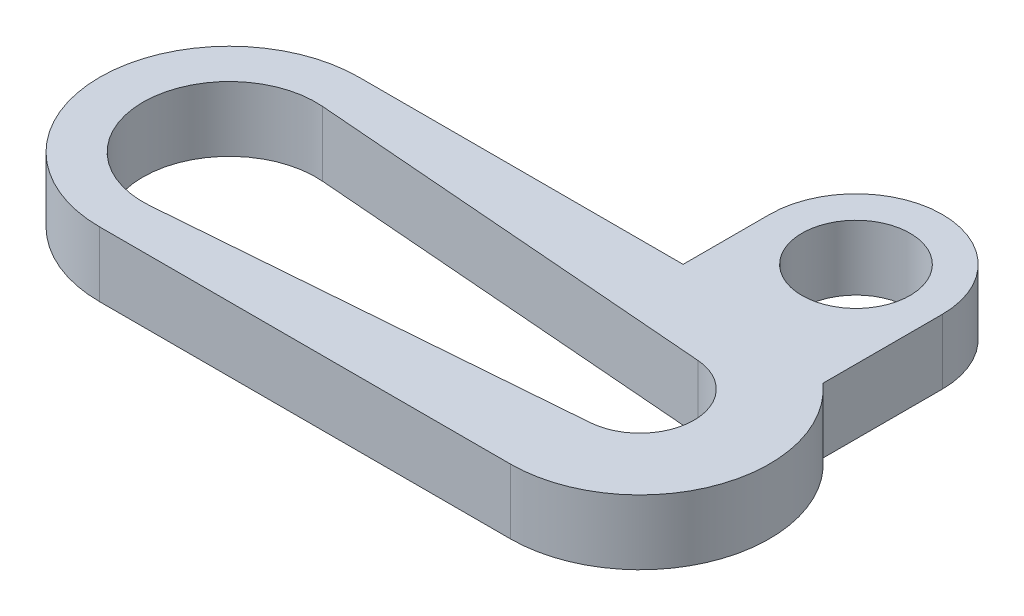
ISO-10303-21;
HEADER;
FILE_DESCRIPTION(('STEP AP214'),'2;1');
FILE_NAME('part.step','',(''),(''),'','','');
FILE_SCHEMA(('AUTOMOTIVE_DESIGN { 1 0 10303 214 1 1 1 1 }'));
ENDSEC;
DATA;
#1=APPLICATION_CONTEXT('core data for automotive mechanical design processes');
#2=APPLICATION_PROTOCOL_DEFINITION('international standard','automotive_design',2000,#1);
#3=PRODUCT_CONTEXT('',#1,'mechanical');
#4=PRODUCT('Part','Part','',(#3));
#5=PRODUCT_RELATED_PRODUCT_CATEGORY('part','',(#4));
#6=PRODUCT_DEFINITION_FORMATION('','',#4);
#7=PRODUCT_DEFINITION_CONTEXT('part definition',#1,'design');
#8=PRODUCT_DEFINITION('design','',#6,#7);
#9=PRODUCT_DEFINITION_SHAPE('','',#8);
#10=(LENGTH_UNIT() NAMED_UNIT(*) SI_UNIT(.MILLI.,.METRE.));
#11=(NAMED_UNIT(*) PLANE_ANGLE_UNIT() SI_UNIT($,.RADIAN.));
#12=(NAMED_UNIT(*) SI_UNIT($,.STERADIAN.) SOLID_ANGLE_UNIT());
#13=UNCERTAINTY_MEASURE_WITH_UNIT(LENGTH_MEASURE(1.E-05),#10,'distance_accuracy_value','');
#14=(GEOMETRIC_REPRESENTATION_CONTEXT(3) GLOBAL_UNCERTAINTY_ASSIGNED_CONTEXT((#13)) GLOBAL_UNIT_ASSIGNED_CONTEXT((#10,
#11,#12)) REPRESENTATION_CONTEXT('',''));
#15=CARTESIAN_POINT('',(0.,0.,0.));
#16=DIRECTION('',(0.,0.,1.));
#17=DIRECTION('',(1.,0.,0.));
#18=AXIS2_PLACEMENT_3D('',#15,#16,#17);
#19=CARTESIAN_POINT('',(19.,3.,0.));
#20=DIRECTION('',(0.,-1.,0.));
#21=DIRECTION('',(0.,0.,-1.));
#22=AXIS2_PLACEMENT_3D('',#19,#20,#21);
#23=CYLINDRICAL_SURFACE('',#22,2.5);
#24=CARTESIAN_POINT('',(19.,0.,0.));
#25=DIRECTION('',(0.,1.,0.));
#26=DIRECTION('',(0.,0.,1.));
#27=AXIS2_PLACEMENT_3D('',#24,#25,#26);
#28=CIRCLE('',#27,2.5);
#29=CARTESIAN_POINT('',(19.1973684210526,0.,2.49219696379945));
#30=VERTEX_POINT('',#29);
#31=CARTESIAN_POINT('',(19.1973684210526,0.,-2.49219696379945));
#32=VERTEX_POINT('',#31);
#33=EDGE_CURVE('E174',#30,#32,#28,.T.);
#34=ORIENTED_EDGE('',*,*,#33,.F.);
#35=DIRECTION('',(0.,-1.,0.));
#36=VECTOR('',#35,1.);
#37=CARTESIAN_POINT('',(19.1973684210526,3.,2.49219696379945));
#38=LINE('',#37,#36);
#39=CARTESIAN_POINT('',(19.1973684210526,3.,2.49219696379945));
#40=VERTEX_POINT('',#39);
#41=EDGE_CURVE('E11',#40,#30,#38,.T.);
#42=ORIENTED_EDGE('',*,*,#41,.F.);
#43=CARTESIAN_POINT('',(19.,3.,0.));
#44=DIRECTION('',(0.,1.,0.));
#45=DIRECTION('',(0.,0.,1.));
#46=AXIS2_PLACEMENT_3D('',#43,#44,#45);
#47=CIRCLE('',#46,2.5);
#48=CARTESIAN_POINT('',(19.1973684210526,3.,-2.49219696379945));
#49=VERTEX_POINT('',#48);
#50=EDGE_CURVE('E138',#40,#49,#47,.T.);
#51=ORIENTED_EDGE('',*,*,#50,.T.);
#52=DIRECTION('',(0.,-1.,0.));
#53=VECTOR('',#52,1.);
#54=CARTESIAN_POINT('',(19.1973684210526,3.,-2.49219696379945));
#55=LINE('',#54,#53);
#56=EDGE_CURVE('E102',#49,#32,#55,.T.);
#57=ORIENTED_EDGE('',*,*,#56,.T.);
#58=EDGE_LOOP('',(#34,#42,#51,#57));
#59=FACE_BOUND('',#58,.T.);
#60=ADVANCED_FACE('F40',(#59),#23,.F.);
#61=CARTESIAN_POINT('',(0.31578947368421,3.,3.98751514207912));
#62=DIRECTION('',(0.0789473684210526,0.,0.996878785519779));
#63=DIRECTION('',(0.99687878551978,0.,-0.0789473684210526));
#64=AXIS2_PLACEMENT_3D('',#61,#62,#63);
#65=PLANE('',#64);
#66=DIRECTION('',(-0.99687878551978,0.,0.0789473684210526));
#67=VECTOR('',#66,1.);
#68=CARTESIAN_POINT('',(0.31578947368421,0.,3.98751514207912));
#69=LINE('',#68,#67);
#70=CARTESIAN_POINT('',(0.31578947368421,0.,3.98751514207912));
#71=VERTEX_POINT('',#70);
#72=EDGE_CURVE('E144',#30,#71,#69,.T.);
#73=ORIENTED_EDGE('',*,*,#72,.T.);
#74=DIRECTION('',(0.,-1.,0.));
#75=VECTOR('',#74,1.);
#76=CARTESIAN_POINT('',(0.31578947368421,3.,3.98751514207912));
#77=LINE('',#76,#75);
#78=CARTESIAN_POINT('',(0.31578947368421,3.,3.98751514207912));
#79=VERTEX_POINT('',#78);
#80=EDGE_CURVE('E50',#79,#71,#77,.T.);
#81=ORIENTED_EDGE('',*,*,#80,.F.);
#82=DIRECTION('',(-0.99687878551978,0.,0.0789473684210526));
#83=VECTOR('',#82,1.);
#84=CARTESIAN_POINT('',(0.31578947368421,3.,3.98751514207912));
#85=LINE('',#84,#83);
#86=EDGE_CURVE('E132',#40,#79,#85,.T.);
#87=ORIENTED_EDGE('',*,*,#86,.F.);
#88=ORIENTED_EDGE('',*,*,#41,.T.);
#89=EDGE_LOOP('',(#73,#81,#87,#88));
#90=FACE_BOUND('',#89,.T.);
#91=ADVANCED_FACE('F142',(#90),#65,.F.);
#92=CARTESIAN_POINT('',(0.,3.,0.));
#93=DIRECTION('',(0.,-1.,0.));
#94=DIRECTION('',(0.,0.,-1.));
#95=AXIS2_PLACEMENT_3D('',#92,#93,#94);
#96=CYLINDRICAL_SURFACE('',#95,4.);
#97=CARTESIAN_POINT('',(0.,0.,0.));
#98=DIRECTION('',(0.,1.,0.));
#99=DIRECTION('',(0.,0.,1.));
#100=AXIS2_PLACEMENT_3D('',#97,#98,#99);
#101=CIRCLE('',#100,4.);
#102=CARTESIAN_POINT('',(0.31578947368421,0.,-3.98751514207912));
#103=VERTEX_POINT('',#102);
#104=EDGE_CURVE('E178',#103,#71,#101,.T.);
#105=ORIENTED_EDGE('',*,*,#104,.F.);
#106=DIRECTION('',(0.,-1.,0.));
#107=VECTOR('',#106,1.);
#108=CARTESIAN_POINT('',(0.31578947368421,3.,-3.98751514207912));
#109=LINE('',#108,#107);
#110=CARTESIAN_POINT('',(0.31578947368421,3.,-3.98751514207912));
#111=VERTEX_POINT('',#110);
#112=EDGE_CURVE('E95',#111,#103,#109,.T.);
#113=ORIENTED_EDGE('',*,*,#112,.F.);
#114=CARTESIAN_POINT('',(0.,3.,0.));
#115=DIRECTION('',(0.,1.,0.));
#116=DIRECTION('',(0.,0.,1.));
#117=AXIS2_PLACEMENT_3D('',#114,#115,#116);
#118=CIRCLE('',#117,4.);
#119=EDGE_CURVE('E137',#111,#79,#118,.T.);
#120=ORIENTED_EDGE('',*,*,#119,.T.);
#121=ORIENTED_EDGE('',*,*,#80,.T.);
#122=EDGE_LOOP('',(#105,#113,#120,#121));
#123=FACE_BOUND('',#122,.T.);
#124=ADVANCED_FACE('F149',(#123),#96,.F.);
#125=CARTESIAN_POINT('',(23.,3.,0.));
#126=DIRECTION('',(1.,0.,0.));
#127=DIRECTION('',(0.,0.,-1.));
#128=AXIS2_PLACEMENT_3D('',#125,#126,#127);
#129=PLANE('',#128);
#130=DIRECTION('',(0.,0.,1.));
#131=VECTOR('',#130,1.);
#132=CARTESIAN_POINT('',(23.,0.,0.));
#133=LINE('',#132,#131);
#134=CARTESIAN_POINT('',(23.,0.,-10.));
#135=VERTEX_POINT('',#134);
#136=CARTESIAN_POINT('',(23.,0.,-4.47213595499958));
#137=VERTEX_POINT('',#136);
#138=EDGE_CURVE('E158',#135,#137,#133,.T.);
#139=ORIENTED_EDGE('',*,*,#138,.F.);
#140=DIRECTION('',(0.,-1.,0.));
#141=VECTOR('',#140,1.);
#142=CARTESIAN_POINT('',(23.,3.,-10.));
#143=LINE('',#142,#141);
#144=CARTESIAN_POINT('',(23.,3.,-10.));
#145=VERTEX_POINT('',#144);
#146=EDGE_CURVE('E44',#145,#135,#143,.T.);
#147=ORIENTED_EDGE('',*,*,#146,.F.);
#148=DIRECTION('',(0.,0.,1.));
#149=VECTOR('',#148,1.);
#150=CARTESIAN_POINT('',(23.,3.,0.));
#151=LINE('',#150,#149);
#152=CARTESIAN_POINT('',(23.,3.,-4.47213595499958));
#153=VERTEX_POINT('',#152);
#154=EDGE_CURVE('E185',#145,#153,#151,.T.);
#155=ORIENTED_EDGE('',*,*,#154,.T.);
#156=DIRECTION('',(0.,-1.,0.));
#157=VECTOR('',#156,1.);
#158=CARTESIAN_POINT('',(23.,3.,-4.47213595499958));
#159=LINE('',#158,#157);
#160=EDGE_CURVE('E157',#153,#137,#159,.T.);
#161=ORIENTED_EDGE('',*,*,#160,.T.);
#162=EDGE_LOOP('',(#139,#147,#155,#161));
#163=FACE_BOUND('',#162,.T.);
#164=ADVANCED_FACE('F42',(#163),#129,.T.);
#165=CARTESIAN_POINT('',(19.,3.,-10.));
#166=DIRECTION('',(0.,-1.,0.));
#167=DIRECTION('',(0.,0.,-1.));
#168=AXIS2_PLACEMENT_3D('',#165,#166,#167);
#169=CYLINDRICAL_SURFACE('',#168,4.);
#170=CARTESIAN_POINT('',(19.,0.,-10.));
#171=DIRECTION('',(0.,1.,0.));
#172=DIRECTION('',(0.,0.,1.));
#173=AXIS2_PLACEMENT_3D('',#170,#171,#172);
#174=CIRCLE('',#173,4.);
#175=CARTESIAN_POINT('',(15.,0.,-10.));
#176=VERTEX_POINT('',#175);
#177=EDGE_CURVE('E161',#135,#176,#174,.T.);
#178=ORIENTED_EDGE('',*,*,#177,.T.);
#179=DIRECTION('',(0.,-1.,0.));
#180=VECTOR('',#179,1.);
#181=CARTESIAN_POINT('',(15.,3.,-10.));
#182=LINE('',#181,#180);
#183=CARTESIAN_POINT('',(15.,3.,-10.));
#184=VERTEX_POINT('',#183);
#185=EDGE_CURVE('E200',#184,#176,#182,.T.);
#186=ORIENTED_EDGE('',*,*,#185,.F.);
#187=CARTESIAN_POINT('',(19.,3.,-10.));
#188=DIRECTION('',(0.,1.,0.));
#189=DIRECTION('',(0.,0.,1.));
#190=AXIS2_PLACEMENT_3D('',#187,#188,#189);
#191=CIRCLE('',#190,4.);
#192=EDGE_CURVE('E209',#145,#184,#191,.T.);
#193=ORIENTED_EDGE('',*,*,#192,.F.);
#194=ORIENTED_EDGE('',*,*,#146,.T.);
#195=EDGE_LOOP('',(#178,#186,#193,#194));
#196=FACE_BOUND('',#195,.T.);
#197=ADVANCED_FACE('F208',(#196),#169,.T.);
#198=CARTESIAN_POINT('',(15.,3.,0.));
#199=DIRECTION('',(1.,0.,0.));
#200=DIRECTION('',(0.,0.,-1.));
#201=AXIS2_PLACEMENT_3D('',#198,#199,#200);
#202=PLANE('',#201);
#203=DIRECTION('',(0.,0.,1.));
#204=VECTOR('',#203,1.);
#205=CARTESIAN_POINT('',(15.,0.,0.));
#206=LINE('',#205,#204);
#207=CARTESIAN_POINT('',(15.,0.,-6.));
#208=VERTEX_POINT('',#207);
#209=EDGE_CURVE('E163',#176,#208,#206,.T.);
#210=ORIENTED_EDGE('',*,*,#209,.T.);
#211=DIRECTION('',(0.,-1.,0.));
#212=VECTOR('',#211,1.);
#213=CARTESIAN_POINT('',(15.,3.,-6.));
#214=LINE('',#213,#212);
#215=CARTESIAN_POINT('',(15.,3.,-6.));
#216=VERTEX_POINT('',#215);
#217=EDGE_CURVE('E198',#216,#208,#214,.T.);
#218=ORIENTED_EDGE('',*,*,#217,.F.);
#219=DIRECTION('',(0.,0.,1.));
#220=VECTOR('',#219,1.);
#221=CARTESIAN_POINT('',(15.,3.,0.));
#222=LINE('',#221,#220);
#223=EDGE_CURVE('E239',#184,#216,#222,.T.);
#224=ORIENTED_EDGE('',*,*,#223,.F.);
#225=ORIENTED_EDGE('',*,*,#185,.T.);
#226=EDGE_LOOP('',(#210,#218,#224,#225));
#227=FACE_BOUND('',#226,.T.);
#228=ADVANCED_FACE('F238',(#227),#202,.F.);
#229=CARTESIAN_POINT('',(0.,3.,-6.));
#230=DIRECTION('',(0.,0.,1.));
#231=DIRECTION('',(1.,0.,0.));
#232=AXIS2_PLACEMENT_3D('',#229,#230,#231);
#233=PLANE('',#232);
#234=DIRECTION('',(-1.,0.,0.));
#235=VECTOR('',#234,1.);
#236=CARTESIAN_POINT('',(0.,0.,-6.));
#237=LINE('',#236,#235);
#238=CARTESIAN_POINT('',(0.,0.,-6.));
#239=VERTEX_POINT('',#238);
#240=EDGE_CURVE('E165',#208,#239,#237,.T.);
#241=ORIENTED_EDGE('',*,*,#240,.T.);
#242=DIRECTION('',(0.,-1.,0.));
#243=VECTOR('',#242,1.);
#244=CARTESIAN_POINT('',(0.,3.,-6.));
#245=LINE('',#244,#243);
#246=CARTESIAN_POINT('',(0.,3.,-6.));
#247=VERTEX_POINT('',#246);
#248=EDGE_CURVE('E195',#247,#239,#245,.T.);
#249=ORIENTED_EDGE('',*,*,#248,.F.);
#250=DIRECTION('',(-1.,0.,0.));
#251=VECTOR('',#250,1.);
#252=CARTESIAN_POINT('',(0.,3.,-6.));
#253=LINE('',#252,#251);
#254=EDGE_CURVE('E236',#216,#247,#253,.T.);
#255=ORIENTED_EDGE('',*,*,#254,.F.);
#256=ORIENTED_EDGE('',*,*,#217,.T.);
#257=EDGE_LOOP('',(#241,#249,#255,#256));
#258=FACE_BOUND('',#257,.T.);
#259=ADVANCED_FACE('F235',(#258),#233,.F.);
#260=CARTESIAN_POINT('',(0.,3.,0.));
#261=DIRECTION('',(0.,-1.,0.));
#262=DIRECTION('',(0.,0.,-1.));
#263=AXIS2_PLACEMENT_3D('',#260,#261,#262);
#264=CYLINDRICAL_SURFACE('',#263,6.);
#265=CARTESIAN_POINT('',(0.,0.,0.));
#266=DIRECTION('',(0.,1.,0.));
#267=DIRECTION('',(0.,0.,1.));
#268=AXIS2_PLACEMENT_3D('',#265,#266,#267);
#269=CIRCLE('',#268,6.);
#270=CARTESIAN_POINT('',(0.,0.,6.));
#271=VERTEX_POINT('',#270);
#272=EDGE_CURVE('E167',#239,#271,#269,.T.);
#273=ORIENTED_EDGE('',*,*,#272,.T.);
#274=DIRECTION('',(0.,-1.,0.));
#275=VECTOR('',#274,1.);
#276=CARTESIAN_POINT('',(0.,3.,6.));
#277=LINE('',#276,#275);
#278=CARTESIAN_POINT('',(0.,3.,6.));
#279=VERTEX_POINT('',#278);
#280=EDGE_CURVE('E192',#279,#271,#277,.T.);
#281=ORIENTED_EDGE('',*,*,#280,.F.);
#282=CARTESIAN_POINT('',(0.,3.,0.));
#283=DIRECTION('',(0.,1.,0.));
#284=DIRECTION('',(0.,0.,1.));
#285=AXIS2_PLACEMENT_3D('',#282,#283,#284);
#286=CIRCLE('',#285,6.);
#287=EDGE_CURVE('E231',#247,#279,#286,.T.);
#288=ORIENTED_EDGE('',*,*,#287,.F.);
#289=ORIENTED_EDGE('',*,*,#248,.T.);
#290=EDGE_LOOP('',(#273,#281,#288,#289));
#291=FACE_BOUND('',#290,.T.);
#292=ADVANCED_FACE('F230',(#291),#264,.T.);
#293=CARTESIAN_POINT('',(0.,3.,6.));
#294=DIRECTION('',(0.,0.,-1.));
#295=DIRECTION('',(-1.,0.,0.));
#296=AXIS2_PLACEMENT_3D('',#293,#294,#295);
#297=PLANE('',#296);
#298=DIRECTION('',(1.,0.,0.));
#299=VECTOR('',#298,1.);
#300=CARTESIAN_POINT('',(0.,0.,6.));
#301=LINE('',#300,#299);
#302=CARTESIAN_POINT('',(19.,0.,6.));
#303=VERTEX_POINT('',#302);
#304=EDGE_CURVE('E169',#271,#303,#301,.T.);
#305=ORIENTED_EDGE('',*,*,#304,.T.);
#306=DIRECTION('',(0.,-1.,0.));
#307=VECTOR('',#306,1.);
#308=CARTESIAN_POINT('',(19.,3.,6.));
#309=LINE('',#308,#307);
#310=CARTESIAN_POINT('',(19.,3.,6.));
#311=VERTEX_POINT('',#310);
#312=EDGE_CURVE('E189',#311,#303,#309,.T.);
#313=ORIENTED_EDGE('',*,*,#312,.F.);
#314=DIRECTION('',(1.,0.,0.));
#315=VECTOR('',#314,1.);
#316=CARTESIAN_POINT('',(0.,3.,6.));
#317=LINE('',#316,#315);
#318=EDGE_CURVE('E227',#279,#311,#317,.T.);
#319=ORIENTED_EDGE('',*,*,#318,.F.);
#320=ORIENTED_EDGE('',*,*,#280,.T.);
#321=EDGE_LOOP('',(#305,#313,#319,#320));
#322=FACE_BOUND('',#321,.T.);
#323=ADVANCED_FACE('F224',(#322),#297,.F.);
#324=CARTESIAN_POINT('',(0.31578947368421,3.,-3.98751514207912));
#325=DIRECTION('',(0.0789473684210526,0.,-0.996878785519779));
#326=DIRECTION('',(-0.99687878551978,0.,-0.0789473684210526));
#327=AXIS2_PLACEMENT_3D('',#324,#325,#326);
#328=PLANE('',#327);
#329=DIRECTION('',(0.99687878551978,0.,0.0789473684210526));
#330=VECTOR('',#329,1.);
#331=CARTESIAN_POINT('',(0.31578947368421,0.,-3.98751514207912));
#332=LINE('',#331,#330);
#333=EDGE_CURVE('E180',#103,#32,#332,.T.);
#334=ORIENTED_EDGE('',*,*,#333,.T.);
#335=ORIENTED_EDGE('',*,*,#56,.F.);
#336=DIRECTION('',(0.99687878551978,0.,0.0789473684210526));
#337=VECTOR('',#336,1.);
#338=CARTESIAN_POINT('',(0.31578947368421,3.,-3.98751514207912));
#339=LINE('',#338,#337);
#340=EDGE_CURVE('E59',#111,#49,#339,.T.);
#341=ORIENTED_EDGE('',*,*,#340,.F.);
#342=ORIENTED_EDGE('',*,*,#112,.T.);
#343=EDGE_LOOP('',(#334,#335,#341,#342));
#344=FACE_BOUND('',#343,.T.);
#345=ADVANCED_FACE('F250',(#344),#328,.F.);
#346=CARTESIAN_POINT('',(19.,3.,0.));
#347=DIRECTION('',(0.,-1.,0.));
#348=DIRECTION('',(0.,0.,-1.));
#349=AXIS2_PLACEMENT_3D('',#346,#347,#348);
#350=CYLINDRICAL_SURFACE('',#349,6.);
#351=CARTESIAN_POINT('',(19.,0.,0.));
#352=DIRECTION('',(0.,1.,0.));
#353=DIRECTION('',(0.,0.,1.));
#354=AXIS2_PLACEMENT_3D('',#351,#352,#353);
#355=CIRCLE('',#354,6.);
#356=EDGE_CURVE('E171',#303,#137,#355,.T.);
#357=ORIENTED_EDGE('',*,*,#356,.T.);
#358=ORIENTED_EDGE('',*,*,#160,.F.);
#359=CARTESIAN_POINT('',(19.,3.,0.));
#360=DIRECTION('',(0.,1.,0.));
#361=DIRECTION('',(0.,0.,1.));
#362=AXIS2_PLACEMENT_3D('',#359,#360,#361);
#363=CIRCLE('',#362,6.);
#364=EDGE_CURVE('E248',#311,#153,#363,.T.);
#365=ORIENTED_EDGE('',*,*,#364,.F.);
#366=ORIENTED_EDGE('',*,*,#312,.T.);
#367=EDGE_LOOP('',(#357,#358,#365,#366));
#368=FACE_BOUND('',#367,.T.);
#369=ADVANCED_FACE('F219',(#368),#350,.T.);
#370=CARTESIAN_POINT('',(19.,3.,-10.));
#371=DIRECTION('',(0.,-1.,0.));
#372=DIRECTION('',(0.,0.,-1.));
#373=AXIS2_PLACEMENT_3D('',#370,#371,#372);
#374=CYLINDRICAL_SURFACE('',#373,2.5);
#375=CARTESIAN_POINT('',(19.,3.,-10.));
#376=DIRECTION('',(0.,1.,0.));
#377=DIRECTION('',(0.,0.,1.));
#378=AXIS2_PLACEMENT_3D('',#375,#376,#377);
#379=CIRCLE('',#378,2.5);
#380=CARTESIAN_POINT('',(19.,3.,-7.5));
#381=VERTEX_POINT('',#380);
#382=EDGE_CURVE('E151',#381,#381,#379,.T.);
#383=ORIENTED_EDGE('',*,*,#382,.T.);
#384=EDGE_LOOP('',(#383));
#385=FACE_BOUND('',#384,.T.);
#386=CARTESIAN_POINT('',(19.,0.,-10.));
#387=DIRECTION('',(0.,1.,0.));
#388=DIRECTION('',(0.,0.,1.));
#389=AXIS2_PLACEMENT_3D('',#386,#387,#388);
#390=CIRCLE('',#389,2.5);
#391=CARTESIAN_POINT('',(19.,0.,-7.5));
#392=VERTEX_POINT('',#391);
#393=EDGE_CURVE('E182',#392,#392,#390,.T.);
#394=ORIENTED_EDGE('',*,*,#393,.F.);
#395=EDGE_LOOP('',(#394));
#396=FACE_BOUND('',#395,.T.);
#397=ADVANCED_FACE('F257',(#385,#396),#374,.F.);
#398=CARTESIAN_POINT('',(0.,3.,0.));
#399=DIRECTION('',(0.,1.,0.));
#400=DIRECTION('',(0.,0.,1.));
#401=AXIS2_PLACEMENT_3D('',#398,#399,#400);
#402=PLANE('',#401);
#403=ORIENTED_EDGE('',*,*,#154,.F.);
#404=ORIENTED_EDGE('',*,*,#192,.T.);
#405=ORIENTED_EDGE('',*,*,#223,.T.);
#406=ORIENTED_EDGE('',*,*,#254,.T.);
#407=ORIENTED_EDGE('',*,*,#287,.T.);
#408=ORIENTED_EDGE('',*,*,#318,.T.);
#409=ORIENTED_EDGE('',*,*,#364,.T.);
#410=EDGE_LOOP('',(#403,#404,#405,#406,#407,#408,#409));
#411=FACE_BOUND('',#410,.T.);
#412=ORIENTED_EDGE('',*,*,#50,.F.);
#413=ORIENTED_EDGE('',*,*,#86,.T.);
#414=ORIENTED_EDGE('',*,*,#119,.F.);
#415=ORIENTED_EDGE('',*,*,#340,.T.);
#416=EDGE_LOOP('',(#412,#413,#414,#415));
#417=FACE_BOUND('',#416,.T.);
#418=ORIENTED_EDGE('',*,*,#382,.F.);
#419=EDGE_LOOP('',(#418));
#420=FACE_BOUND('',#419,.T.);
#421=ADVANCED_FACE('F134',(#411,#417,#420),#402,.T.);
#422=CARTESIAN_POINT('',(0.,0.,0.));
#423=DIRECTION('',(0.,1.,0.));
#424=DIRECTION('',(0.,0.,1.));
#425=AXIS2_PLACEMENT_3D('',#422,#423,#424);
#426=PLANE('',#425);
#427=ORIENTED_EDGE('',*,*,#138,.T.);
#428=ORIENTED_EDGE('',*,*,#356,.F.);
#429=ORIENTED_EDGE('',*,*,#304,.F.);
#430=ORIENTED_EDGE('',*,*,#272,.F.);
#431=ORIENTED_EDGE('',*,*,#240,.F.);
#432=ORIENTED_EDGE('',*,*,#209,.F.);
#433=ORIENTED_EDGE('',*,*,#177,.F.);
#434=EDGE_LOOP('',(#427,#428,#429,#430,#431,#432,#433));
#435=FACE_BOUND('',#434,.T.);
#436=ORIENTED_EDGE('',*,*,#33,.T.);
#437=ORIENTED_EDGE('',*,*,#333,.F.);
#438=ORIENTED_EDGE('',*,*,#104,.T.);
#439=ORIENTED_EDGE('',*,*,#72,.F.);
#440=EDGE_LOOP('',(#436,#437,#438,#439));
#441=FACE_BOUND('',#440,.T.);
#442=ORIENTED_EDGE('',*,*,#393,.T.);
#443=EDGE_LOOP('',(#442));
#444=FACE_BOUND('',#443,.T.);
#445=ADVANCED_FACE('F212',(#435,#441,#444),#426,.F.);
#446=CLOSED_SHELL('',(#60,#91,#124,#164,#197,#228,#259,#292,#323,#345,#369,#397,#421,#445));
#447=MANIFOLD_SOLID_BREP('B2',#446);
#448=ADVANCED_BREP_SHAPE_REPRESENTATION('',(#18,#447),#14);
#449=SHAPE_DEFINITION_REPRESENTATION(#9,#448);
ENDSEC;
END-ISO-10303-21;
